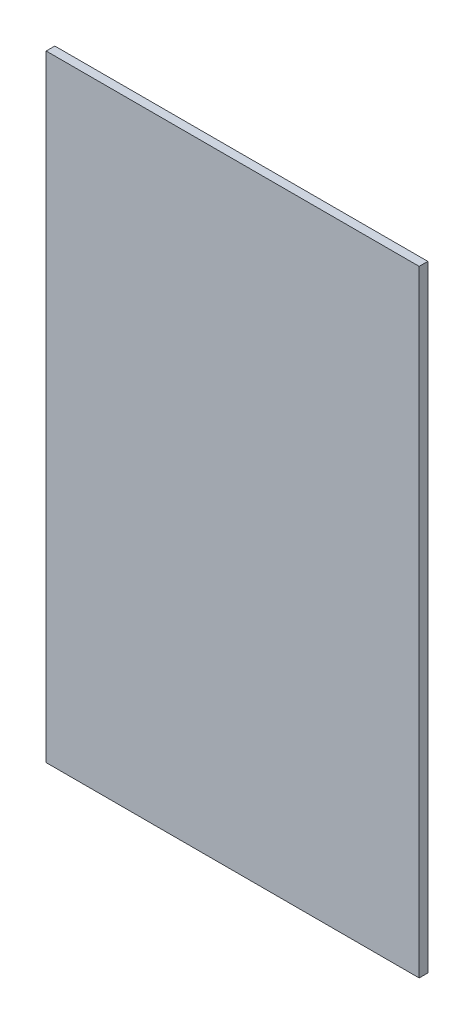
ISO-10303-21;
HEADER;
FILE_DESCRIPTION(('STEP AP214'),'2;1');
FILE_NAME('part.step','',(''),(''),'','','');
FILE_SCHEMA(('AUTOMOTIVE_DESIGN { 1 0 10303 214 1 1 1 1 }'));
ENDSEC;
DATA;
#1=APPLICATION_CONTEXT('core data for automotive mechanical design processes');
#2=APPLICATION_PROTOCOL_DEFINITION('international standard','automotive_design',2000,#1);
#3=PRODUCT_CONTEXT('',#1,'mechanical');
#4=PRODUCT('Part','Part','',(#3));
#5=PRODUCT_RELATED_PRODUCT_CATEGORY('part','',(#4));
#6=PRODUCT_DEFINITION_FORMATION('','',#4);
#7=PRODUCT_DEFINITION_CONTEXT('part definition',#1,'design');
#8=PRODUCT_DEFINITION('design','',#6,#7);
#9=PRODUCT_DEFINITION_SHAPE('','',#8);
#10=(LENGTH_UNIT() NAMED_UNIT(*) SI_UNIT(.MILLI.,.METRE.));
#11=(NAMED_UNIT(*) PLANE_ANGLE_UNIT() SI_UNIT($,.RADIAN.));
#12=(NAMED_UNIT(*) SI_UNIT($,.STERADIAN.) SOLID_ANGLE_UNIT());
#13=UNCERTAINTY_MEASURE_WITH_UNIT(LENGTH_MEASURE(1.E-05),#10,'distance_accuracy_value','');
#14=(GEOMETRIC_REPRESENTATION_CONTEXT(3) GLOBAL_UNCERTAINTY_ASSIGNED_CONTEXT((#13)) GLOBAL_UNIT_ASSIGNED_CONTEXT((#10,
#11,#12)) REPRESENTATION_CONTEXT('',''));
#15=CARTESIAN_POINT('',(0.,0.,0.));
#16=DIRECTION('',(0.,0.,1.));
#17=DIRECTION('',(1.,0.,0.));
#18=AXIS2_PLACEMENT_3D('',#15,#16,#17);
#19=CARTESIAN_POINT('',(-27.7759815242494,-53.972286374134,1.6));
#20=DIRECTION('',(0.,1.,0.));
#21=DIRECTION('',(0.,0.,1.));
#22=AXIS2_PLACEMENT_3D('',#19,#20,#21);
#23=PLANE('',#22);
#24=DIRECTION('',(1.,0.,0.));
#25=VECTOR('',#24,1.);
#26=CARTESIAN_POINT('',(-27.7759815242494,-53.972286374134,0.));
#27=LINE('',#26,#25);
#28=CARTESIAN_POINT('',(-27.7759815242494,-53.972286374134,0.));
#29=VERTEX_POINT('',#28);
#30=CARTESIAN_POINT('',(41.2240184757506,-53.972286374134,0.));
#31=VERTEX_POINT('',#30);
#32=EDGE_CURVE('E106',#29,#31,#27,.T.);
#33=ORIENTED_EDGE('',*,*,#32,.T.);
#34=DIRECTION('',(0.,0.,-1.));
#35=VECTOR('',#34,1.);
#36=CARTESIAN_POINT('',(41.2240184757506,-53.972286374134,1.6));
#37=LINE('',#36,#35);
#38=CARTESIAN_POINT('',(41.2240184757506,-53.972286374134,1.6));
#39=VERTEX_POINT('',#38);
#40=EDGE_CURVE('E11',#39,#31,#37,.T.);
#41=ORIENTED_EDGE('',*,*,#40,.F.);
#42=DIRECTION('',(1.,0.,0.));
#43=VECTOR('',#42,1.);
#44=CARTESIAN_POINT('',(-27.7759815242494,-53.972286374134,1.6));
#45=LINE('',#44,#43);
#46=CARTESIAN_POINT('',(-27.7759815242494,-53.972286374134,1.6));
#47=VERTEX_POINT('',#46);
#48=EDGE_CURVE('E92',#47,#39,#45,.T.);
#49=ORIENTED_EDGE('',*,*,#48,.F.);
#50=DIRECTION('',(0.,0.,-1.));
#51=VECTOR('',#50,1.);
#52=CARTESIAN_POINT('',(-27.7759815242494,-53.972286374134,1.6));
#53=LINE('',#52,#51);
#54=EDGE_CURVE('E59',#47,#29,#53,.T.);
#55=ORIENTED_EDGE('',*,*,#54,.T.);
#56=EDGE_LOOP('',(#33,#41,#49,#55));
#57=FACE_BOUND('',#56,.T.);
#58=ADVANCED_FACE('F43',(#57),#23,.F.);
#59=CARTESIAN_POINT('',(41.2240184757506,-53.972286374134,1.6));
#60=DIRECTION('',(-1.,0.,0.));
#61=DIRECTION('',(0.,0.,1.));
#62=AXIS2_PLACEMENT_3D('',#59,#60,#61);
#63=PLANE('',#62);
#64=DIRECTION('',(0.,1.,0.));
#65=VECTOR('',#64,1.);
#66=CARTESIAN_POINT('',(41.2240184757506,-53.972286374134,0.));
#67=LINE('',#66,#65);
#68=CARTESIAN_POINT('',(41.2240184757506,60.027713625866,0.));
#69=VERTEX_POINT('',#68);
#70=EDGE_CURVE('E97',#31,#69,#67,.T.);
#71=ORIENTED_EDGE('',*,*,#70,.T.);
#72=DIRECTION('',(0.,0.,-1.));
#73=VECTOR('',#72,1.);
#74=CARTESIAN_POINT('',(41.2240184757506,60.027713625866,1.6));
#75=LINE('',#74,#73);
#76=CARTESIAN_POINT('',(41.2240184757506,60.027713625866,1.6));
#77=VERTEX_POINT('',#76);
#78=EDGE_CURVE('E51',#77,#69,#75,.T.);
#79=ORIENTED_EDGE('',*,*,#78,.F.);
#80=DIRECTION('',(0.,1.,0.));
#81=VECTOR('',#80,1.);
#82=CARTESIAN_POINT('',(41.2240184757506,-53.972286374134,1.6));
#83=LINE('',#82,#81);
#84=EDGE_CURVE('E84',#39,#77,#83,.T.);
#85=ORIENTED_EDGE('',*,*,#84,.F.);
#86=ORIENTED_EDGE('',*,*,#40,.T.);
#87=EDGE_LOOP('',(#71,#79,#85,#86));
#88=FACE_BOUND('',#87,.T.);
#89=ADVANCED_FACE('F96',(#88),#63,.F.);
#90=CARTESIAN_POINT('',(-27.7759815242494,60.027713625866,1.6));
#91=DIRECTION('',(0.,1.,0.));
#92=DIRECTION('',(0.,0.,1.));
#93=AXIS2_PLACEMENT_3D('',#90,#91,#92);
#94=PLANE('',#93);
#95=DIRECTION('',(1.,0.,0.));
#96=VECTOR('',#95,1.);
#97=CARTESIAN_POINT('',(-27.7759815242494,60.027713625866,0.));
#98=LINE('',#97,#96);
#99=CARTESIAN_POINT('',(-27.7759815242494,60.027713625866,0.));
#100=VERTEX_POINT('',#99);
#101=EDGE_CURVE('E109',#100,#69,#98,.T.);
#102=ORIENTED_EDGE('',*,*,#101,.F.);
#103=DIRECTION('',(0.,0.,-1.));
#104=VECTOR('',#103,1.);
#105=CARTESIAN_POINT('',(-27.7759815242494,60.027713625866,1.6));
#106=LINE('',#105,#104);
#107=CARTESIAN_POINT('',(-27.7759815242494,60.027713625866,1.6));
#108=VERTEX_POINT('',#107);
#109=EDGE_CURVE('E73',#108,#100,#106,.T.);
#110=ORIENTED_EDGE('',*,*,#109,.F.);
#111=DIRECTION('',(1.,0.,0.));
#112=VECTOR('',#111,1.);
#113=CARTESIAN_POINT('',(-27.7759815242494,60.027713625866,1.6));
#114=LINE('',#113,#112);
#115=EDGE_CURVE('E91',#108,#77,#114,.T.);
#116=ORIENTED_EDGE('',*,*,#115,.T.);
#117=ORIENTED_EDGE('',*,*,#78,.T.);
#118=EDGE_LOOP('',(#102,#110,#116,#117));
#119=FACE_BOUND('',#118,.T.);
#120=ADVANCED_FACE('F100',(#119),#94,.T.);
#121=CARTESIAN_POINT('',(-27.7759815242494,-53.972286374134,1.6));
#122=DIRECTION('',(-1.,0.,0.));
#123=DIRECTION('',(0.,0.,1.));
#124=AXIS2_PLACEMENT_3D('',#121,#122,#123);
#125=PLANE('',#124);
#126=DIRECTION('',(0.,1.,0.));
#127=VECTOR('',#126,1.);
#128=CARTESIAN_POINT('',(-27.7759815242494,-53.972286374134,0.));
#129=LINE('',#128,#127);
#130=EDGE_CURVE('E111',#29,#100,#129,.T.);
#131=ORIENTED_EDGE('',*,*,#130,.F.);
#132=ORIENTED_EDGE('',*,*,#54,.F.);
#133=DIRECTION('',(0.,1.,0.));
#134=VECTOR('',#133,1.);
#135=CARTESIAN_POINT('',(-27.7759815242494,-53.972286374134,1.6));
#136=LINE('',#135,#134);
#137=EDGE_CURVE('E101',#47,#108,#136,.T.);
#138=ORIENTED_EDGE('',*,*,#137,.T.);
#139=ORIENTED_EDGE('',*,*,#109,.T.);
#140=EDGE_LOOP('',(#131,#132,#138,#139));
#141=FACE_BOUND('',#140,.T.);
#142=ADVANCED_FACE('F117',(#141),#125,.T.);
#143=CARTESIAN_POINT('',(0.,0.,1.6));
#144=DIRECTION('',(0.,0.,1.));
#145=DIRECTION('',(1.,0.,0.));
#146=AXIS2_PLACEMENT_3D('',#143,#144,#145);
#147=PLANE('',#146);
#148=ORIENTED_EDGE('',*,*,#48,.T.);
#149=ORIENTED_EDGE('',*,*,#84,.T.);
#150=ORIENTED_EDGE('',*,*,#115,.F.);
#151=ORIENTED_EDGE('',*,*,#137,.F.);
#152=EDGE_LOOP('',(#148,#149,#150,#151));
#153=FACE_BOUND('',#152,.T.);
#154=ADVANCED_FACE('F88',(#153),#147,.T.);
#155=CARTESIAN_POINT('',(0.,0.,0.));
#156=DIRECTION('',(0.,0.,1.));
#157=DIRECTION('',(1.,0.,0.));
#158=AXIS2_PLACEMENT_3D('',#155,#156,#157);
#159=PLANE('',#158);
#160=ORIENTED_EDGE('',*,*,#32,.F.);
#161=ORIENTED_EDGE('',*,*,#130,.T.);
#162=ORIENTED_EDGE('',*,*,#101,.T.);
#163=ORIENTED_EDGE('',*,*,#70,.F.);
#164=EDGE_LOOP('',(#160,#161,#162,#163));
#165=FACE_BOUND('',#164,.T.);
#166=ADVANCED_FACE('F116',(#165),#159,.F.);
#167=CLOSED_SHELL('',(#58,#89,#120,#142,#154,#166));
#168=MANIFOLD_SOLID_BREP('B2',#167);
#169=ADVANCED_BREP_SHAPE_REPRESENTATION('',(#18,#168),#14);
#170=SHAPE_DEFINITION_REPRESENTATION(#9,#169);
ENDSEC;
END-ISO-10303-21;
